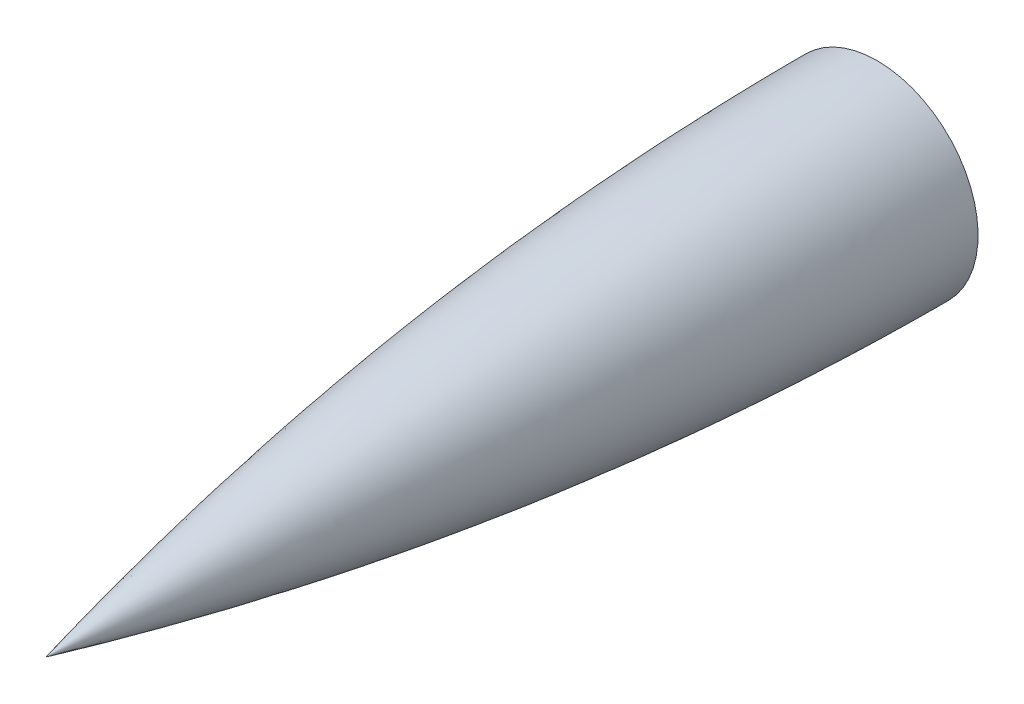
ISO-10303-21;
HEADER;
FILE_DESCRIPTION(('STEP AP214'),'2;1');
FILE_NAME('part.step','',(''),(''),'','','');
FILE_SCHEMA(('AUTOMOTIVE_DESIGN { 1 0 10303 214 1 1 1 1 }'));
ENDSEC;
DATA;
#1=APPLICATION_CONTEXT('core data for automotive mechanical design processes');
#2=APPLICATION_PROTOCOL_DEFINITION('international standard','automotive_design',2000,#1);
#3=PRODUCT_CONTEXT('',#1,'mechanical');
#4=PRODUCT('Part','Part','',(#3));
#5=PRODUCT_RELATED_PRODUCT_CATEGORY('part','',(#4));
#6=PRODUCT_DEFINITION_FORMATION('','',#4);
#7=PRODUCT_DEFINITION_CONTEXT('part definition',#1,'design');
#8=PRODUCT_DEFINITION('design','',#6,#7);
#9=PRODUCT_DEFINITION_SHAPE('','',#8);
#10=(LENGTH_UNIT() NAMED_UNIT(*) SI_UNIT(.MILLI.,.METRE.));
#11=(NAMED_UNIT(*) PLANE_ANGLE_UNIT() SI_UNIT($,.RADIAN.));
#12=(NAMED_UNIT(*) SI_UNIT($,.STERADIAN.) SOLID_ANGLE_UNIT());
#13=UNCERTAINTY_MEASURE_WITH_UNIT(LENGTH_MEASURE(1.E-05),#10,'distance_accuracy_value','');
#14=(GEOMETRIC_REPRESENTATION_CONTEXT(3) GLOBAL_UNCERTAINTY_ASSIGNED_CONTEXT((#13)) GLOBAL_UNIT_ASSIGNED_CONTEXT((#10,
#11,#12)) REPRESENTATION_CONTEXT('',''));
#15=CARTESIAN_POINT('',(0.,0.,0.));
#16=DIRECTION('',(0.,0.,1.));
#17=DIRECTION('',(1.,0.,0.));
#18=AXIS2_PLACEMENT_3D('',#15,#16,#17);
#19=CARTESIAN_POINT('',(0.,50.8,1.96578864297692E-11));
#20=CARTESIAN_POINT('',(0.,50.7999999997833,209.549999998252));
#21=CARTESIAN_POINT('',(0.,4.23833711182819E-10,419.099999996432));
#22=B_SPLINE_CURVE_WITH_KNOTS('',2,(#19,#20,#21),.UNSPECIFIED.,.F.,.F.,(3,3),
(0.0817799048513342,0.916525445894861),.UNSPECIFIED.);
#23=CARTESIAN_POINT('',(0.,0.,0.));
#24=DIRECTION('',(0.,0.,-1.));
#25=AXIS1_PLACEMENT('',#23,#24);
#26=SURFACE_OF_REVOLUTION('',#22,#25);
#27=CARTESIAN_POINT('',(0.,0.,419.09999999818));
#28=VERTEX_POINT('',#27);
#29=VERTEX_LOOP('',#28);
#30=FACE_BOUND('',#29,.T.);
#31=CARTESIAN_POINT('',(0.,0.,0.));
#32=DIRECTION('',(0.,0.,-1.));
#33=DIRECTION('',(-1.,0.,0.));
#34=AXIS2_PLACEMENT_3D('',#31,#32,#33);
#35=CIRCLE('',#34,50.8);
#36=CARTESIAN_POINT('',(-50.8,0.,0.));
#37=VERTEX_POINT('',#36);
#38=EDGE_CURVE('E11',#37,#37,#35,.T.);
#39=ORIENTED_EDGE('',*,*,#38,.F.);
#40=EDGE_LOOP('',(#39));
#41=FACE_BOUND('',#40,.T.);
#42=ADVANCED_FACE('F40',(#30,#41),#26,.F.);
#43=CARTESIAN_POINT('',(0.,50.8,0.));
#44=DIRECTION('',(0.,0.,-1.));
#45=DIRECTION('',(-1.,0.,0.));
#46=AXIS2_PLACEMENT_3D('',#43,#44,#45);
#47=PLANE('',#46);
#48=ORIENTED_EDGE('',*,*,#38,.T.);
#49=EDGE_LOOP('',(#48));
#50=FACE_BOUND('',#49,.T.);
#51=ADVANCED_FACE('F50',(#50),#47,.T.);
#52=CLOSED_SHELL('',(#42,#51));
#53=MANIFOLD_SOLID_BREP('B2',#52);
#54=ADVANCED_BREP_SHAPE_REPRESENTATION('',(#18,#53),#14);
#55=SHAPE_DEFINITION_REPRESENTATION(#9,#54);
ENDSEC;
END-ISO-10303-21;
